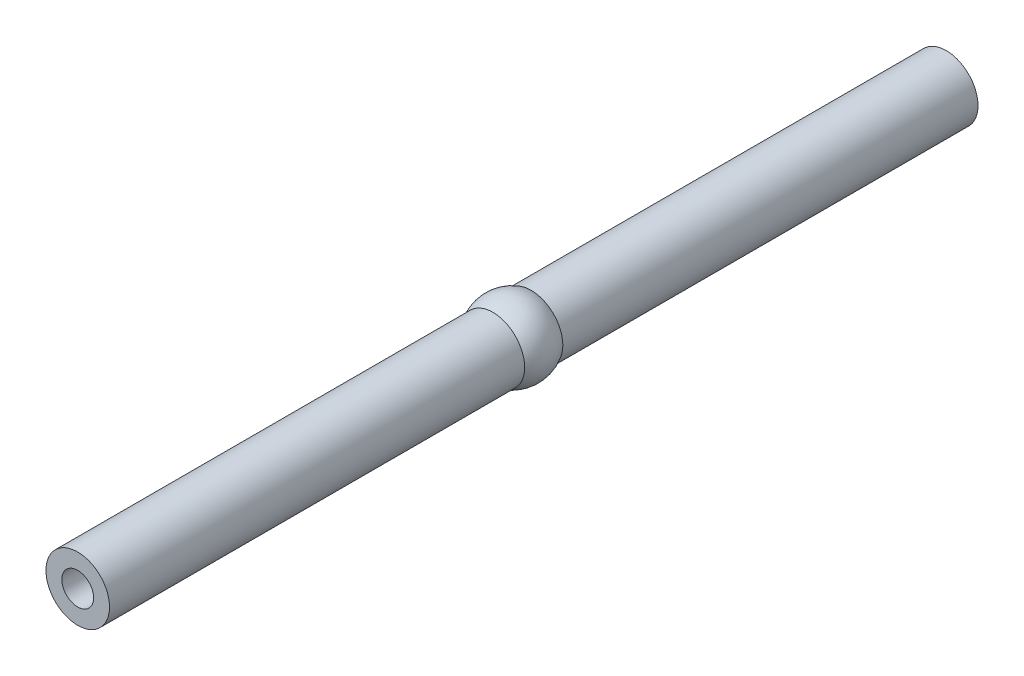
ISO-10303-21;
HEADER;
FILE_DESCRIPTION(('STEP AP214'),'2;1');
FILE_NAME('part.step','',(''),(''),'','','');
FILE_SCHEMA(('AUTOMOTIVE_DESIGN { 1 0 10303 214 1 1 1 1 }'));
ENDSEC;
DATA;
#1=APPLICATION_CONTEXT('core data for automotive mechanical design processes');
#2=APPLICATION_PROTOCOL_DEFINITION('international standard','automotive_design',2000,#1);
#3=PRODUCT_CONTEXT('',#1,'mechanical');
#4=PRODUCT('Part','Part','',(#3));
#5=PRODUCT_RELATED_PRODUCT_CATEGORY('part','',(#4));
#6=PRODUCT_DEFINITION_FORMATION('','',#4);
#7=PRODUCT_DEFINITION_CONTEXT('part definition',#1,'design');
#8=PRODUCT_DEFINITION('design','',#6,#7);
#9=PRODUCT_DEFINITION_SHAPE('','',#8);
#10=(LENGTH_UNIT() NAMED_UNIT(*) SI_UNIT(.MILLI.,.METRE.));
#11=(NAMED_UNIT(*) PLANE_ANGLE_UNIT() SI_UNIT($,.RADIAN.));
#12=(NAMED_UNIT(*) SI_UNIT($,.STERADIAN.) SOLID_ANGLE_UNIT());
#13=UNCERTAINTY_MEASURE_WITH_UNIT(LENGTH_MEASURE(1.E-05),#10,'distance_accuracy_value','');
#14=(GEOMETRIC_REPRESENTATION_CONTEXT(3) GLOBAL_UNCERTAINTY_ASSIGNED_CONTEXT((#13)) GLOBAL_UNIT_ASSIGNED_CONTEXT((#10,
#11,#12)) REPRESENTATION_CONTEXT('',''));
#15=CARTESIAN_POINT('',(0.,0.,0.));
#16=DIRECTION('',(0.,0.,1.));
#17=DIRECTION('',(1.,0.,0.));
#18=AXIS2_PLACEMENT_3D('',#15,#16,#17);
#19=CARTESIAN_POINT('',(0.,0.,41.));
#20=DIRECTION('',(0.,0.,-1.));
#21=DIRECTION('',(-1.,0.,0.));
#22=AXIS2_PLACEMENT_3D('',#19,#20,#21);
#23=CYLINDRICAL_SURFACE('',#22,3.);
#24=CARTESIAN_POINT('',(0.,0.,-1.802775637732));
#25=DIRECTION('',(0.,0.,1.));
#26=DIRECTION('',(1.,0.,0.));
#27=AXIS2_PLACEMENT_3D('',#24,#25,#26);
#28=CIRCLE('',#27,3.);
#29=CARTESIAN_POINT('',(3.,0.,-1.802775637732));
#30=VERTEX_POINT('',#29);
#31=EDGE_CURVE('E37',#30,#30,#28,.F.);
#32=ORIENTED_EDGE('',*,*,#31,.T.);
#33=EDGE_LOOP('',(#32));
#34=FACE_BOUND('',#33,.T.);
#35=CARTESIAN_POINT('',(0.,0.,-41.));
#36=DIRECTION('',(0.,0.,1.));
#37=DIRECTION('',(1.,0.,0.));
#38=AXIS2_PLACEMENT_3D('',#35,#36,#37);
#39=CIRCLE('',#38,3.);
#40=CARTESIAN_POINT('',(3.,0.,-41.));
#41=VERTEX_POINT('',#40);
#42=EDGE_CURVE('E41',#41,#41,#39,.T.);
#43=ORIENTED_EDGE('',*,*,#42,.T.);
#44=EDGE_LOOP('',(#43));
#45=FACE_BOUND('',#44,.T.);
#46=ADVANCED_FACE('F33',(#34,#45),#23,.T.);
#47=CARTESIAN_POINT('',(0.,0.,-41.));
#48=DIRECTION('',(0.,0.,1.));
#49=DIRECTION('',(1.,0.,0.));
#50=AXIS2_PLACEMENT_3D('',#47,#48,#49);
#51=PLANE('',#50);
#52=ORIENTED_EDGE('',*,*,#42,.F.);
#53=EDGE_LOOP('',(#52));
#54=FACE_BOUND('',#53,.T.);
#55=CARTESIAN_POINT('',(0.,0.,-41.));
#56=DIRECTION('',(0.,0.,1.));
#57=DIRECTION('',(1.,0.,0.));
#58=AXIS2_PLACEMENT_3D('',#55,#56,#57);
#59=CIRCLE('',#58,1.5);
#60=CARTESIAN_POINT('',(1.5,0.,-41.));
#61=VERTEX_POINT('',#60);
#62=EDGE_CURVE('E54',#61,#61,#59,.T.);
#63=ORIENTED_EDGE('',*,*,#62,.T.);
#64=EDGE_LOOP('',(#63));
#65=FACE_BOUND('',#64,.T.);
#66=ADVANCED_FACE('F85',(#54,#65),#51,.F.);
#67=CARTESIAN_POINT('',(0.,0.,-31.));
#68=DIRECTION('',(0.,0.,-1.));
#69=DIRECTION('',(-1.,0.,0.));
#70=AXIS2_PLACEMENT_3D('',#67,#68,#69);
#71=CYLINDRICAL_SURFACE('',#70,1.5);
#72=CARTESIAN_POINT('',(0.,0.,-31.));
#73=DIRECTION('',(0.,0.,1.));
#74=DIRECTION('',(1.,0.,0.));
#75=AXIS2_PLACEMENT_3D('',#72,#73,#74);
#76=CIRCLE('',#75,1.5);
#77=CARTESIAN_POINT('',(1.5,0.,-31.));
#78=VERTEX_POINT('',#77);
#79=EDGE_CURVE('E58',#78,#78,#76,.T.);
#80=ORIENTED_EDGE('',*,*,#79,.T.);
#81=EDGE_LOOP('',(#80));
#82=FACE_BOUND('',#81,.T.);
#83=ORIENTED_EDGE('',*,*,#62,.F.);
#84=EDGE_LOOP('',(#83));
#85=FACE_BOUND('',#84,.T.);
#86=ADVANCED_FACE('F89',(#82,#85),#71,.F.);
#87=CARTESIAN_POINT('',(0.,0.,-31.));
#88=DIRECTION('',(0.,0.,-1.));
#89=DIRECTION('',(1.,0.,0.));
#90=AXIS2_PLACEMENT_3D('',#87,#88,#89);
#91=PLANE('',#90);
#92=ORIENTED_EDGE('',*,*,#79,.F.);
#93=EDGE_LOOP('',(#92));
#94=FACE_BOUND('',#93,.T.);
#95=ADVANCED_FACE('F96',(#94),#91,.T.);
#96=CARTESIAN_POINT('',(0.,0.,0.));
#97=DIRECTION('',(0.,0.,-1.));
#98=DIRECTION('',(1.,0.,0.));
#99=AXIS2_PLACEMENT_3D('',#96,#97,#98);
#100=SPHERICAL_SURFACE('',#99,3.5);
#101=CARTESIAN_POINT('',(0.,0.,1.802775637732));
#102=DIRECTION('',(0.,0.,-1.));
#103=DIRECTION('',(-1.,0.,0.));
#104=AXIS2_PLACEMENT_3D('',#101,#102,#103);
#105=CIRCLE('',#104,3.);
#106=CARTESIAN_POINT('',(3.,0.,1.802775637732));
#107=VERTEX_POINT('',#106);
#108=EDGE_CURVE('E49',#107,#107,#105,.F.);
#109=CARTESIAN_POINT('',(3.,0.,1.802775637732));
#110=CARTESIAN_POINT('',(3.02032276109282,0.,1.76895705072467));
#111=CARTESIAN_POINT('',(3.0400731999107,0.,1.73479455955507));
#112=CARTESIAN_POINT('',(3.0784078982649,0.,1.66582142159716));
#113=CARTESIAN_POINT('',(3.09699215780121,0.,1.63101077480884));
#114=CARTESIAN_POINT('',(3.13297296286061,0.,1.56078097831934));
#115=CARTESIAN_POINT('',(3.1503695083837,0.,1.52536182861815));
#116=CARTESIAN_POINT('',(3.18395506629843,0.,1.45395557350236));
#117=CARTESIAN_POINT('',(3.20014407869009,0.,1.41796846808777));
#118=CARTESIAN_POINT('',(3.23129603640389,0.,1.34546744503921));
#119=CARTESIAN_POINT('',(3.24625898172604,0.,1.30895352740524));
#120=CARTESIAN_POINT('',(3.27494169914558,0.,1.2354406401324));
#121=CARTESIAN_POINT('',(3.28866147124297,0.,1.19844167049353));
#122=CARTESIAN_POINT('',(3.31484215087211,0.,1.12400099030846));
#123=CARTESIAN_POINT('',(3.32730305840386,0.,1.08655927976226));
#124=CARTESIAN_POINT('',(3.35095175903643,0.,1.01127593620098));
#125=CARTESIAN_POINT('',(3.36213955213726,0.,0.973434303185896));
#126=CARTESIAN_POINT('',(3.38322922947876,0.,0.897394390201076));
#127=CARTESIAN_POINT('',(3.39313111371944,0.,0.859196110231334));
#128=CARTESIAN_POINT('',(3.41163764960502,0.,0.782486586785238));
#129=CARTESIAN_POINT('',(3.42024230124992,0.,0.743975343308883));
#130=CARTESIAN_POINT('',(3.43614453168395,0.,0.666683934181992));
#131=CARTESIAN_POINT('',(3.44344211047309,0.,0.627903768531457));
#132=CARTESIAN_POINT('',(3.45672184970951,0.,0.550118863932466));
#133=CARTESIAN_POINT('',(3.4627040101568,0.,0.511114124984011));
#134=CARTESIAN_POINT('',(3.47334607152918,0.,0.432924679485344));
#135=CARTESIAN_POINT('',(3.47800597245426,0.,0.393739972935131));
#136=CARTESIAN_POINT('',(3.48599818573437,0.,0.315235403739871));
#137=CARTESIAN_POINT('',(3.48933049808939,0.,0.275915541094823));
#138=CARTESIAN_POINT('',(3.49466372340743,0.,0.197185625780798));
#139=CARTESIAN_POINT('',(3.49666463637044,0.,0.157775573111821));
#140=CARTESIAN_POINT('',(3.49933277466673,0.,0.078910346961896));
#141=CARTESIAN_POINT('',(3.5,0.,0.039455173480948));
#142=CARTESIAN_POINT('',(3.5,0.,-0.039455173480948));
#143=CARTESIAN_POINT('',(3.49933277466673,0.,-0.078910346961896));
#144=CARTESIAN_POINT('',(3.49666463637044,0.,-0.157775573111821));
#145=CARTESIAN_POINT('',(3.49466372340743,0.,-0.197185625780798));
#146=CARTESIAN_POINT('',(3.48933049808939,0.,-0.275915541094823));
#147=CARTESIAN_POINT('',(3.48599818573437,0.,-0.315235403739871));
#148=CARTESIAN_POINT('',(3.47800597245426,0.,-0.393739972935131));
#149=CARTESIAN_POINT('',(3.47334607152918,0.,-0.432924679485344));
#150=CARTESIAN_POINT('',(3.4627040101568,0.,-0.511114124984011));
#151=CARTESIAN_POINT('',(3.45672184970951,0.,-0.550118863932467));
#152=CARTESIAN_POINT('',(3.44344211047309,0.,-0.627903768531457));
#153=CARTESIAN_POINT('',(3.43614453168395,0.,-0.666683934181992));
#154=CARTESIAN_POINT('',(3.42024230124992,0.,-0.743975343308883));
#155=CARTESIAN_POINT('',(3.41163764960502,0.,-0.782486586785238));
#156=CARTESIAN_POINT('',(3.39313111371944,0.,-0.859196110231334));
#157=CARTESIAN_POINT('',(3.38322922947876,0.,-0.897394390201076));
#158=CARTESIAN_POINT('',(3.36213955213726,0.,-0.973434303185896));
#159=CARTESIAN_POINT('',(3.35095175903643,0.,-1.01127593620098));
#160=CARTESIAN_POINT('',(3.32730305840386,0.,-1.08655927976226));
#161=CARTESIAN_POINT('',(3.31484215087211,0.,-1.12400099030846));
#162=CARTESIAN_POINT('',(3.28866147124297,0.,-1.19844167049353));
#163=CARTESIAN_POINT('',(3.27494169914558,0.,-1.2354406401324));
#164=CARTESIAN_POINT('',(3.24625898172604,0.,-1.30895352740524));
#165=CARTESIAN_POINT('',(3.23129603640389,0.,-1.34546744503921));
#166=CARTESIAN_POINT('',(3.20014407869009,0.,-1.41796846808777));
#167=CARTESIAN_POINT('',(3.18395506629843,0.,-1.45395557350236));
#168=CARTESIAN_POINT('',(3.1503695083837,0.,-1.52536182861815));
#169=CARTESIAN_POINT('',(3.13297296286061,0.,-1.56078097831934));
#170=CARTESIAN_POINT('',(3.09699215780121,0.,-1.63101077480884));
#171=CARTESIAN_POINT('',(3.0784078982649,0.,-1.66582142159716));
#172=CARTESIAN_POINT('',(3.0400731999107,0.,-1.73479455955507));
#173=CARTESIAN_POINT('',(3.02032276109282,0.,-1.76895705072467));
#174=CARTESIAN_POINT('',(3.,0.,-1.802775637732));
#175=B_SPLINE_CURVE_WITH_KNOTS('',3,(#109,#110,#111,#112,#113,#114,#115,#116,#117,#118,#119,
#120,#121,#122,#123,#124,#125,#126,#127,#128,#129,#130,#131,#132,#133,#134,#135,#136,#137,#138,
#139,#140,#141,#142,#143,#144,#145,#146,#147,#148,#149,#150,#151,#152,#153,#154,#155,#156,#157,
#158,#159,#160,#161,#162,#163,#164,#165,#166,#167,#168,#169,#170,#171,#172,#173,#174),
.UNSPECIFIED.,.F.,.F.,(4,2,2,2,2,2,2,2,2,2,2,2,2,2,2,2,2,2,2,2,2,2,2,2,2,2,2,2,2,2,2,2,4),(0.,
0.118359880744646,0.236719761489292,0.355079642233938,0.473439522978584,0.59179940372323,
0.710159284467876,0.828519165212522,0.946879045957168,1.06523892670181,1.18359880744646,
1.30195868819111,1.42031856893575,1.5386784496804,1.65703833042504,1.77539821116969,
1.89375809191434,2.01211797265898,2.13047785340363,2.24883773414827,2.36719761489292,
2.48555749563757,2.60391737638221,2.72227725712686,2.8406371378715,2.95899701861615,
3.0773568993608,3.19571678010544,3.31407666085009,3.43243654159473,3.55079642233938,
3.66915630308403,3.78751618382867),.UNSPECIFIED.);
#176=EDGE_CURVE('BSEAM101',#107,#30,#175,.T.);
#177=ORIENTED_EDGE('',*,*,#108,.F.);
#178=ORIENTED_EDGE('',*,*,#31,.F.);
#179=ORIENTED_EDGE('',*,*,#176,.T.);
#180=ORIENTED_EDGE('',*,*,#176,.F.);
#181=EDGE_LOOP('',(#177,#179,#178,#180));
#182=FACE_BOUND('',#181,.T.);
#183=ADVANCED_FACE('F101',(#182),#100,.T.);
#184=CARTESIAN_POINT('',(0.,0.,31.));
#185=DIRECTION('',(0.,0.,1.));
#186=DIRECTION('',(1.,0.,0.));
#187=AXIS2_PLACEMENT_3D('',#184,#185,#186);
#188=PLANE('',#187);
#189=CARTESIAN_POINT('',(0.,0.,31.));
#190=DIRECTION('',(0.,0.,1.));
#191=DIRECTION('',(1.,0.,0.));
#192=AXIS2_PLACEMENT_3D('',#189,#190,#191);
#193=CIRCLE('',#192,1.5);
#194=CARTESIAN_POINT('',(1.5,0.,31.));
#195=VERTEX_POINT('',#194);
#196=EDGE_CURVE('E46',#195,#195,#193,.T.);
#197=ORIENTED_EDGE('',*,*,#196,.T.);
#198=EDGE_LOOP('',(#197));
#199=FACE_BOUND('',#198,.T.);
#200=ADVANCED_FACE('F70',(#199),#188,.T.);
#201=CARTESIAN_POINT('',(0.,0.,31.));
#202=DIRECTION('',(0.,0.,1.));
#203=DIRECTION('',(1.,0.,0.));
#204=AXIS2_PLACEMENT_3D('',#201,#202,#203);
#205=CYLINDRICAL_SURFACE('',#204,1.5);
#206=ORIENTED_EDGE('',*,*,#196,.F.);
#207=EDGE_LOOP('',(#206));
#208=FACE_BOUND('',#207,.T.);
#209=CARTESIAN_POINT('',(0.,0.,41.));
#210=DIRECTION('',(0.,0.,1.));
#211=DIRECTION('',(1.,0.,0.));
#212=AXIS2_PLACEMENT_3D('',#209,#210,#211);
#213=CIRCLE('',#212,1.5);
#214=CARTESIAN_POINT('',(1.5,0.,41.));
#215=VERTEX_POINT('',#214);
#216=EDGE_CURVE('E63',#215,#215,#213,.T.);
#217=ORIENTED_EDGE('',*,*,#216,.T.);
#218=EDGE_LOOP('',(#217));
#219=FACE_BOUND('',#218,.T.);
#220=ADVANCED_FACE('F72',(#208,#219),#205,.F.);
#221=CARTESIAN_POINT('',(0.,0.,41.));
#222=DIRECTION('',(0.,0.,1.));
#223=DIRECTION('',(1.,0.,0.));
#224=AXIS2_PLACEMENT_3D('',#221,#222,#223);
#225=PLANE('',#224);
#226=ORIENTED_EDGE('',*,*,#216,.F.);
#227=EDGE_LOOP('',(#226));
#228=FACE_BOUND('',#227,.T.);
#229=CARTESIAN_POINT('',(0.,0.,41.));
#230=DIRECTION('',(0.,0.,1.));
#231=DIRECTION('',(1.,0.,0.));
#232=AXIS2_PLACEMENT_3D('',#229,#230,#231);
#233=CIRCLE('',#232,3.);
#234=CARTESIAN_POINT('',(3.,0.,41.));
#235=VERTEX_POINT('',#234);
#236=EDGE_CURVE('E10',#235,#235,#233,.T.);
#237=ORIENTED_EDGE('',*,*,#236,.T.);
#238=EDGE_LOOP('',(#237));
#239=FACE_BOUND('',#238,.T.);
#240=ADVANCED_FACE('F75',(#228,#239),#225,.T.);
#241=ORIENTED_EDGE('',*,*,#108,.T.);
#242=EDGE_LOOP('',(#241));
#243=FACE_BOUND('',#242,.T.);
#244=ORIENTED_EDGE('',*,*,#236,.F.);
#245=EDGE_LOOP('',(#244));
#246=FACE_BOUND('',#245,.T.);
#247=ADVANCED_FACE('F35',(#243,#246),#23,.T.);
#248=CLOSED_SHELL('',(#46,#66,#86,#95,#183,#200,#220,#240,#247));
#249=MANIFOLD_SOLID_BREP('B2',#248);
#250=ADVANCED_BREP_SHAPE_REPRESENTATION('',(#18,#249),#14);
#251=SHAPE_DEFINITION_REPRESENTATION(#9,#250);
ENDSEC;
END-ISO-10303-21;
